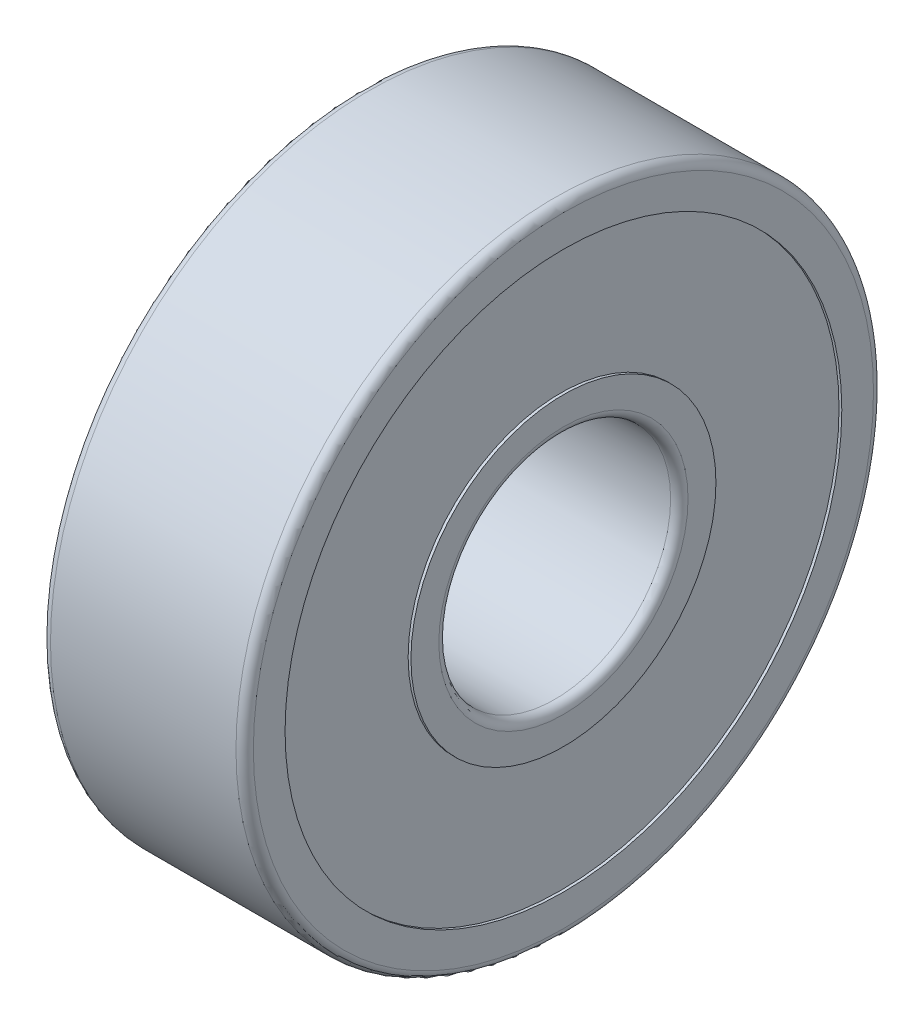
ISO-10303-21;
HEADER;
FILE_DESCRIPTION(('STEP AP214'),'2;1');
FILE_NAME('part.step','',(''),(''),'','','');
FILE_SCHEMA(('AUTOMOTIVE_DESIGN { 1 0 10303 214 1 1 1 1 }'));
ENDSEC;
DATA;
#1=APPLICATION_CONTEXT('core data for automotive mechanical design processes');
#2=APPLICATION_PROTOCOL_DEFINITION('international standard','automotive_design',2000,#1);
#3=PRODUCT_CONTEXT('',#1,'mechanical');
#4=PRODUCT('Part','Part','',(#3));
#5=PRODUCT_RELATED_PRODUCT_CATEGORY('part','',(#4));
#6=PRODUCT_DEFINITION_FORMATION('','',#4);
#7=PRODUCT_DEFINITION_CONTEXT('part definition',#1,'design');
#8=PRODUCT_DEFINITION('design','',#6,#7);
#9=PRODUCT_DEFINITION_SHAPE('','',#8);
#10=(LENGTH_UNIT() NAMED_UNIT(*) SI_UNIT(.MILLI.,.METRE.));
#11=(NAMED_UNIT(*) PLANE_ANGLE_UNIT() SI_UNIT($,.RADIAN.));
#12=(NAMED_UNIT(*) SI_UNIT($,.STERADIAN.) SOLID_ANGLE_UNIT());
#13=UNCERTAINTY_MEASURE_WITH_UNIT(LENGTH_MEASURE(1.E-05),#10,'distance_accuracy_value','');
#14=(GEOMETRIC_REPRESENTATION_CONTEXT(3) GLOBAL_UNCERTAINTY_ASSIGNED_CONTEXT((#13)) GLOBAL_UNIT_ASSIGNED_CONTEXT((#10,
#11,#12)) REPRESENTATION_CONTEXT('',''));
#15=CARTESIAN_POINT('',(0.,0.,0.));
#16=DIRECTION('',(0.,0.,1.));
#17=DIRECTION('',(1.,0.,0.));
#18=AXIS2_PLACEMENT_3D('',#15,#16,#17);
#19=CARTESIAN_POINT('',(6.7,0.,0.));
#20=DIRECTION('',(-1.,0.,0.));
#21=DIRECTION('',(0.,0.,1.));
#22=AXIS2_PLACEMENT_3D('',#19,#20,#21);
#23=TOROIDAL_SURFACE('',#22,4.3,0.300000000000003);
#24=CARTESIAN_POINT('',(6.7,0.,0.));
#25=DIRECTION('',(-1.,0.,0.));
#26=DIRECTION('',(0.,0.,1.));
#27=AXIS2_PLACEMENT_3D('',#24,#25,#26);
#28=CIRCLE('',#27,4.);
#29=CARTESIAN_POINT('',(6.7,0.,4.));
#30=VERTEX_POINT('',#29);
#31=EDGE_CURVE('E10',#30,#30,#28,.T.);
#32=ORIENTED_EDGE('',*,*,#31,.T.);
#33=EDGE_LOOP('',(#32));
#34=FACE_BOUND('',#33,.T.);
#35=CARTESIAN_POINT('',(7.,0.,0.));
#36=DIRECTION('',(-1.,0.,0.));
#37=DIRECTION('',(0.,0.,1.));
#38=AXIS2_PLACEMENT_3D('',#35,#36,#37);
#39=CIRCLE('',#38,4.3);
#40=CARTESIAN_POINT('',(7.,0.,4.3));
#41=VERTEX_POINT('',#40);
#42=EDGE_CURVE('E82',#41,#41,#39,.T.);
#43=ORIENTED_EDGE('',*,*,#42,.F.);
#44=EDGE_LOOP('',(#43));
#45=FACE_BOUND('',#44,.T.);
#46=ADVANCED_FACE('F30',(#34,#45),#23,.T.);
#47=CARTESIAN_POINT('',(7.00353760818078,0.,0.));
#48=DIRECTION('',(-1.,0.,0.));
#49=DIRECTION('',(0.,0.,1.));
#50=AXIS2_PLACEMENT_3D('',#47,#48,#49);
#51=CYLINDRICAL_SURFACE('',#50,4.);
#52=CARTESIAN_POINT('',(0.300000000000003,0.,0.));
#53=DIRECTION('',(-1.,0.,0.));
#54=DIRECTION('',(0.,0.,1.));
#55=AXIS2_PLACEMENT_3D('',#52,#53,#54);
#56=CIRCLE('',#55,4.);
#57=CARTESIAN_POINT('',(0.300000000000003,0.,4.));
#58=VERTEX_POINT('',#57);
#59=EDGE_CURVE('E36',#58,#58,#56,.T.);
#60=ORIENTED_EDGE('',*,*,#59,.T.);
#61=EDGE_LOOP('',(#60));
#62=FACE_BOUND('',#61,.T.);
#63=ORIENTED_EDGE('',*,*,#31,.F.);
#64=EDGE_LOOP('',(#63));
#65=FACE_BOUND('',#64,.T.);
#66=ADVANCED_FACE('F90',(#62,#65),#51,.F.);
#67=CARTESIAN_POINT('',(0.300000000000002,0.,0.));
#68=DIRECTION('',(-1.,0.,0.));
#69=DIRECTION('',(0.,0.,1.));
#70=AXIS2_PLACEMENT_3D('',#67,#68,#69);
#71=TOROIDAL_SURFACE('',#70,4.3,0.300000000000002);
#72=CARTESIAN_POINT('',(0.,0.,0.));
#73=DIRECTION('',(-1.,0.,0.));
#74=DIRECTION('',(0.,0.,1.));
#75=AXIS2_PLACEMENT_3D('',#72,#73,#74);
#76=CIRCLE('',#75,4.3);
#77=CARTESIAN_POINT('',(0.,0.,4.3));
#78=VERTEX_POINT('',#77);
#79=EDGE_CURVE('E40',#78,#78,#76,.T.);
#80=ORIENTED_EDGE('',*,*,#79,.T.);
#81=EDGE_LOOP('',(#80));
#82=FACE_BOUND('',#81,.T.);
#83=ORIENTED_EDGE('',*,*,#59,.F.);
#84=EDGE_LOOP('',(#83));
#85=FACE_BOUND('',#84,.T.);
#86=ADVANCED_FACE('F94',(#82,#85),#71,.T.);
#87=CARTESIAN_POINT('',(0.,4.3,0.));
#88=DIRECTION('',(-1.,0.,0.));
#89=DIRECTION('',(0.,0.,1.));
#90=AXIS2_PLACEMENT_3D('',#87,#88,#89);
#91=PLANE('',#90);
#92=CARTESIAN_POINT('',(0.,0.,0.));
#93=DIRECTION('',(-1.,0.,0.));
#94=DIRECTION('',(0.,0.,1.));
#95=AXIS2_PLACEMENT_3D('',#92,#93,#94);
#96=CIRCLE('',#95,5.2629);
#97=CARTESIAN_POINT('',(0.,0.,5.2629));
#98=VERTEX_POINT('',#97);
#99=EDGE_CURVE('E44',#98,#98,#96,.T.);
#100=ORIENTED_EDGE('',*,*,#99,.T.);
#101=EDGE_LOOP('',(#100));
#102=FACE_BOUND('',#101,.T.);
#103=ORIENTED_EDGE('',*,*,#79,.F.);
#104=EDGE_LOOP('',(#103));
#105=FACE_BOUND('',#104,.T.);
#106=ADVANCED_FACE('F98',(#102,#105),#91,.T.);
#107=CARTESIAN_POINT('',(7.00353760818078,0.,0.));
#108=DIRECTION('',(-1.,0.,0.));
#109=DIRECTION('',(0.,0.,1.));
#110=AXIS2_PLACEMENT_3D('',#107,#108,#109);
#111=CYLINDRICAL_SURFACE('',#110,5.2629);
#112=CARTESIAN_POINT('',(0.0956000000000004,0.,0.));
#113=DIRECTION('',(-1.,0.,0.));
#114=DIRECTION('',(0.,0.,1.));
#115=AXIS2_PLACEMENT_3D('',#112,#113,#114);
#116=CIRCLE('',#115,5.2629);
#117=CARTESIAN_POINT('',(0.0956000000000004,0.,5.2629));
#118=VERTEX_POINT('',#117);
#119=EDGE_CURVE('E49',#118,#118,#116,.T.);
#120=ORIENTED_EDGE('',*,*,#119,.T.);
#121=EDGE_LOOP('',(#120));
#122=FACE_BOUND('',#121,.T.);
#123=ORIENTED_EDGE('',*,*,#99,.F.);
#124=EDGE_LOOP('',(#123));
#125=FACE_BOUND('',#124,.T.);
#126=ADVANCED_FACE('F105',(#122,#125),#111,.T.);
#127=CARTESIAN_POINT('',(0.0956000000000004,5.2629,0.));
#128=DIRECTION('',(-1.,0.,0.));
#129=DIRECTION('',(0.,0.,1.));
#130=AXIS2_PLACEMENT_3D('',#127,#128,#129);
#131=PLANE('',#130);
#132=CARTESIAN_POINT('',(0.0956000000000004,0.,0.));
#133=DIRECTION('',(-1.,0.,0.));
#134=DIRECTION('',(0.,0.,1.));
#135=AXIS2_PLACEMENT_3D('',#132,#133,#134);
#136=CIRCLE('',#135,9.6056);
#137=CARTESIAN_POINT('',(0.0956000000000004,0.,9.6056));
#138=VERTEX_POINT('',#137);
#139=EDGE_CURVE('E52',#138,#138,#136,.T.);
#140=ORIENTED_EDGE('',*,*,#139,.T.);
#141=EDGE_LOOP('',(#140));
#142=FACE_BOUND('',#141,.T.);
#143=ORIENTED_EDGE('',*,*,#119,.F.);
#144=EDGE_LOOP('',(#143));
#145=FACE_BOUND('',#144,.T.);
#146=ADVANCED_FACE('F109',(#142,#145),#131,.T.);
#147=CARTESIAN_POINT('',(7.00353760818078,0.,0.));
#148=DIRECTION('',(-1.,0.,0.));
#149=DIRECTION('',(0.,0.,1.));
#150=AXIS2_PLACEMENT_3D('',#147,#148,#149);
#151=CYLINDRICAL_SURFACE('',#150,9.6056);
#152=CARTESIAN_POINT('',(0.,0.,0.));
#153=DIRECTION('',(-1.,0.,0.));
#154=DIRECTION('',(0.,0.,1.));
#155=AXIS2_PLACEMENT_3D('',#152,#153,#154);
#156=CIRCLE('',#155,9.6056);
#157=CARTESIAN_POINT('',(0.,0.,9.6056));
#158=VERTEX_POINT('',#157);
#159=EDGE_CURVE('E55',#158,#158,#156,.T.);
#160=ORIENTED_EDGE('',*,*,#159,.T.);
#161=EDGE_LOOP('',(#160));
#162=FACE_BOUND('',#161,.T.);
#163=ORIENTED_EDGE('',*,*,#139,.F.);
#164=EDGE_LOOP('',(#163));
#165=FACE_BOUND('',#164,.T.);
#166=ADVANCED_FACE('F113',(#162,#165),#151,.F.);
#167=CARTESIAN_POINT('',(0.,9.6056,0.));
#168=DIRECTION('',(-1.,0.,0.));
#169=DIRECTION('',(0.,0.,1.));
#170=AXIS2_PLACEMENT_3D('',#167,#168,#169);
#171=PLANE('',#170);
#172=CARTESIAN_POINT('',(0.,0.,0.));
#173=DIRECTION('',(-1.,0.,0.));
#174=DIRECTION('',(0.,0.,1.));
#175=AXIS2_PLACEMENT_3D('',#172,#173,#174);
#176=CIRCLE('',#175,10.7);
#177=CARTESIAN_POINT('',(0.,0.,10.7));
#178=VERTEX_POINT('',#177);
#179=EDGE_CURVE('E58',#178,#178,#176,.T.);
#180=ORIENTED_EDGE('',*,*,#179,.T.);
#181=EDGE_LOOP('',(#180));
#182=FACE_BOUND('',#181,.T.);
#183=ORIENTED_EDGE('',*,*,#159,.F.);
#184=EDGE_LOOP('',(#183));
#185=FACE_BOUND('',#184,.T.);
#186=ADVANCED_FACE('F117',(#182,#185),#171,.T.);
#187=CARTESIAN_POINT('',(0.299999999999999,0.,0.));
#188=DIRECTION('',(-1.,0.,0.));
#189=DIRECTION('',(0.,0.,1.));
#190=AXIS2_PLACEMENT_3D('',#187,#188,#189);
#191=TOROIDAL_SURFACE('',#190,10.7,0.299999999999999);
#192=CARTESIAN_POINT('',(0.3,0.,0.));
#193=DIRECTION('',(-1.,0.,0.));
#194=DIRECTION('',(0.,0.,1.));
#195=AXIS2_PLACEMENT_3D('',#192,#193,#194);
#196=CIRCLE('',#195,11.);
#197=CARTESIAN_POINT('',(0.3,0.,11.));
#198=VERTEX_POINT('',#197);
#199=EDGE_CURVE('E61',#198,#198,#196,.T.);
#200=ORIENTED_EDGE('',*,*,#199,.T.);
#201=EDGE_LOOP('',(#200));
#202=FACE_BOUND('',#201,.T.);
#203=ORIENTED_EDGE('',*,*,#179,.F.);
#204=EDGE_LOOP('',(#203));
#205=FACE_BOUND('',#204,.T.);
#206=ADVANCED_FACE('F121',(#202,#205),#191,.T.);
#207=CARTESIAN_POINT('',(7.00353760818078,0.,0.));
#208=DIRECTION('',(-1.,0.,0.));
#209=DIRECTION('',(0.,0.,1.));
#210=AXIS2_PLACEMENT_3D('',#207,#208,#209);
#211=CYLINDRICAL_SURFACE('',#210,11.);
#212=CARTESIAN_POINT('',(6.7,0.,0.));
#213=DIRECTION('',(-1.,0.,0.));
#214=DIRECTION('',(0.,0.,1.));
#215=AXIS2_PLACEMENT_3D('',#212,#213,#214);
#216=CIRCLE('',#215,11.);
#217=CARTESIAN_POINT('',(6.7,0.,11.));
#218=VERTEX_POINT('',#217);
#219=EDGE_CURVE('E64',#218,#218,#216,.T.);
#220=ORIENTED_EDGE('',*,*,#219,.T.);
#221=EDGE_LOOP('',(#220));
#222=FACE_BOUND('',#221,.T.);
#223=ORIENTED_EDGE('',*,*,#199,.F.);
#224=EDGE_LOOP('',(#223));
#225=FACE_BOUND('',#224,.T.);
#226=ADVANCED_FACE('F125',(#222,#225),#211,.T.);
#227=CARTESIAN_POINT('',(6.7,0.,0.));
#228=DIRECTION('',(-1.,0.,0.));
#229=DIRECTION('',(0.,0.,1.));
#230=AXIS2_PLACEMENT_3D('',#227,#228,#229);
#231=TOROIDAL_SURFACE('',#230,10.7,0.3);
#232=CARTESIAN_POINT('',(7.,0.,0.));
#233=DIRECTION('',(-1.,0.,0.));
#234=DIRECTION('',(0.,0.,1.));
#235=AXIS2_PLACEMENT_3D('',#232,#233,#234);
#236=CIRCLE('',#235,10.7);
#237=CARTESIAN_POINT('',(7.,0.,10.7));
#238=VERTEX_POINT('',#237);
#239=EDGE_CURVE('E67',#238,#238,#236,.T.);
#240=ORIENTED_EDGE('',*,*,#239,.T.);
#241=EDGE_LOOP('',(#240));
#242=FACE_BOUND('',#241,.T.);
#243=ORIENTED_EDGE('',*,*,#219,.F.);
#244=EDGE_LOOP('',(#243));
#245=FACE_BOUND('',#244,.T.);
#246=ADVANCED_FACE('F129',(#242,#245),#231,.T.);
#247=CARTESIAN_POINT('',(7.,10.7,0.));
#248=DIRECTION('',(1.,0.,0.));
#249=DIRECTION('',(0.,0.,-1.));
#250=AXIS2_PLACEMENT_3D('',#247,#248,#249);
#251=PLANE('',#250);
#252=CARTESIAN_POINT('',(7.,0.,0.));
#253=DIRECTION('',(-1.,0.,0.));
#254=DIRECTION('',(0.,0.,1.));
#255=AXIS2_PLACEMENT_3D('',#252,#253,#254);
#256=CIRCLE('',#255,9.6056);
#257=CARTESIAN_POINT('',(7.,0.,9.6056));
#258=VERTEX_POINT('',#257);
#259=EDGE_CURVE('E70',#258,#258,#256,.T.);
#260=ORIENTED_EDGE('',*,*,#259,.T.);
#261=EDGE_LOOP('',(#260));
#262=FACE_BOUND('',#261,.T.);
#263=ORIENTED_EDGE('',*,*,#239,.F.);
#264=EDGE_LOOP('',(#263));
#265=FACE_BOUND('',#264,.T.);
#266=ADVANCED_FACE('F133',(#262,#265),#251,.T.);
#267=CARTESIAN_POINT('',(7.00353760818078,0.,0.));
#268=DIRECTION('',(-1.,0.,0.));
#269=DIRECTION('',(0.,0.,1.));
#270=AXIS2_PLACEMENT_3D('',#267,#268,#269);
#271=CYLINDRICAL_SURFACE('',#270,9.6056);
#272=CARTESIAN_POINT('',(6.9044,0.,0.));
#273=DIRECTION('',(-1.,0.,0.));
#274=DIRECTION('',(0.,0.,1.));
#275=AXIS2_PLACEMENT_3D('',#272,#273,#274);
#276=CIRCLE('',#275,9.6056);
#277=CARTESIAN_POINT('',(6.9044,0.,9.6056));
#278=VERTEX_POINT('',#277);
#279=EDGE_CURVE('E73',#278,#278,#276,.T.);
#280=ORIENTED_EDGE('',*,*,#279,.T.);
#281=EDGE_LOOP('',(#280));
#282=FACE_BOUND('',#281,.T.);
#283=ORIENTED_EDGE('',*,*,#259,.F.);
#284=EDGE_LOOP('',(#283));
#285=FACE_BOUND('',#284,.T.);
#286=ADVANCED_FACE('F137',(#282,#285),#271,.F.);
#287=CARTESIAN_POINT('',(6.9044,9.6056,0.));
#288=DIRECTION('',(1.,0.,0.));
#289=DIRECTION('',(0.,0.,-1.));
#290=AXIS2_PLACEMENT_3D('',#287,#288,#289);
#291=PLANE('',#290);
#292=CARTESIAN_POINT('',(6.9044,0.,0.));
#293=DIRECTION('',(-1.,0.,0.));
#294=DIRECTION('',(0.,0.,1.));
#295=AXIS2_PLACEMENT_3D('',#292,#293,#294);
#296=CIRCLE('',#295,5.2629);
#297=CARTESIAN_POINT('',(6.9044,0.,5.2629));
#298=VERTEX_POINT('',#297);
#299=EDGE_CURVE('E76',#298,#298,#296,.T.);
#300=ORIENTED_EDGE('',*,*,#299,.T.);
#301=EDGE_LOOP('',(#300));
#302=FACE_BOUND('',#301,.T.);
#303=ORIENTED_EDGE('',*,*,#279,.F.);
#304=EDGE_LOOP('',(#303));
#305=FACE_BOUND('',#304,.T.);
#306=ADVANCED_FACE('F141',(#302,#305),#291,.T.);
#307=CARTESIAN_POINT('',(7.00353760818078,0.,0.));
#308=DIRECTION('',(-1.,0.,0.));
#309=DIRECTION('',(0.,0.,1.));
#310=AXIS2_PLACEMENT_3D('',#307,#308,#309);
#311=CYLINDRICAL_SURFACE('',#310,5.2629);
#312=CARTESIAN_POINT('',(7.,0.,0.));
#313=DIRECTION('',(-1.,0.,0.));
#314=DIRECTION('',(0.,0.,1.));
#315=AXIS2_PLACEMENT_3D('',#312,#313,#314);
#316=CIRCLE('',#315,5.2629);
#317=CARTESIAN_POINT('',(7.,0.,5.2629));
#318=VERTEX_POINT('',#317);
#319=EDGE_CURVE('E79',#318,#318,#316,.T.);
#320=ORIENTED_EDGE('',*,*,#319,.T.);
#321=EDGE_LOOP('',(#320));
#322=FACE_BOUND('',#321,.T.);
#323=ORIENTED_EDGE('',*,*,#299,.F.);
#324=EDGE_LOOP('',(#323));
#325=FACE_BOUND('',#324,.T.);
#326=ADVANCED_FACE('F145',(#322,#325),#311,.T.);
#327=CARTESIAN_POINT('',(7.,5.2629,0.));
#328=DIRECTION('',(1.,0.,0.));
#329=DIRECTION('',(0.,0.,-1.));
#330=AXIS2_PLACEMENT_3D('',#327,#328,#329);
#331=PLANE('',#330);
#332=ORIENTED_EDGE('',*,*,#42,.T.);
#333=EDGE_LOOP('',(#332));
#334=FACE_BOUND('',#333,.T.);
#335=ORIENTED_EDGE('',*,*,#319,.F.);
#336=EDGE_LOOP('',(#335));
#337=FACE_BOUND('',#336,.T.);
#338=ADVANCED_FACE('F86',(#334,#337),#331,.T.);
#339=CLOSED_SHELL('',(#46,#66,#86,#106,#126,#146,#166,#186,#206,#226,#246,#266,#286,#306,#326,#338));
#340=MANIFOLD_SOLID_BREP('B2',#339);
#341=ADVANCED_BREP_SHAPE_REPRESENTATION('',(#18,#340),#14);
#342=SHAPE_DEFINITION_REPRESENTATION(#9,#341);
ENDSEC;
END-ISO-10303-21;
